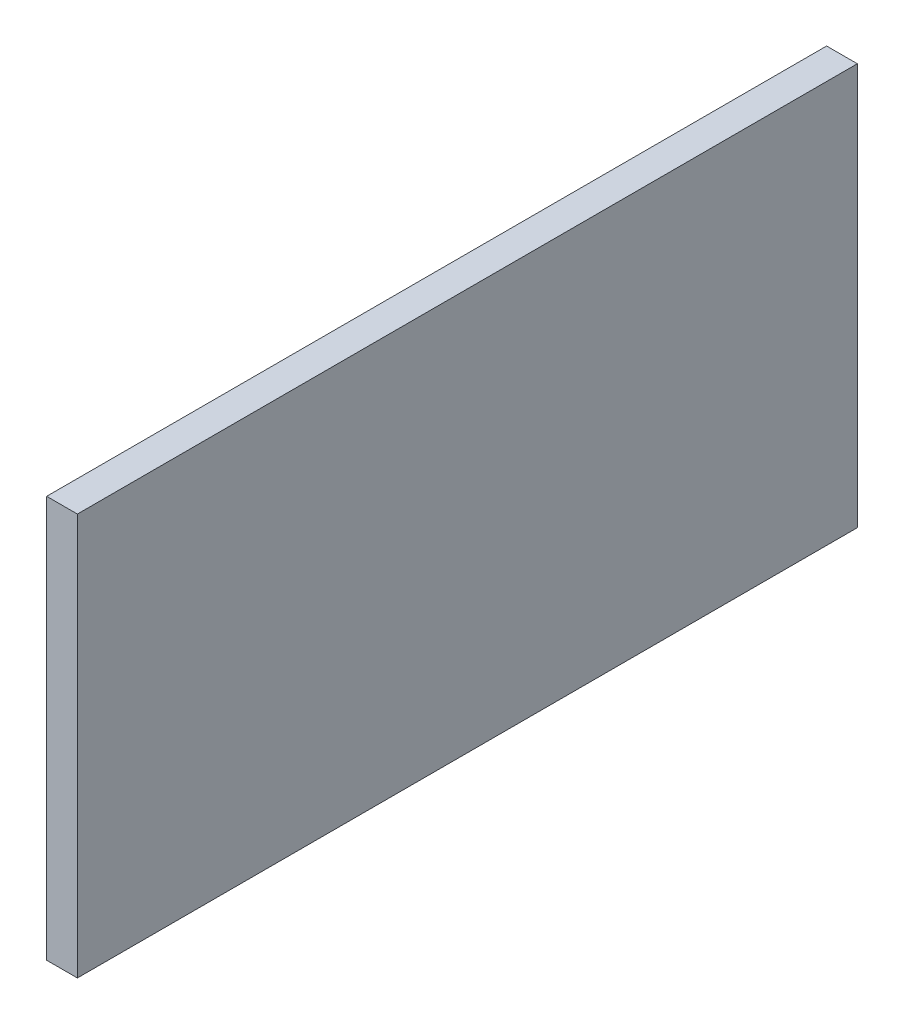
ISO-10303-21;
HEADER;
FILE_DESCRIPTION(('STEP AP214'),'2;1');
FILE_NAME('part.step','',(''),(''),'','','');
FILE_SCHEMA(('AUTOMOTIVE_DESIGN { 1 0 10303 214 1 1 1 1 }'));
ENDSEC;
DATA;
#1=APPLICATION_CONTEXT('core data for automotive mechanical design processes');
#2=APPLICATION_PROTOCOL_DEFINITION('international standard','automotive_design',2000,#1);
#3=PRODUCT_CONTEXT('',#1,'mechanical');
#4=PRODUCT('Part','Part','',(#3));
#5=PRODUCT_RELATED_PRODUCT_CATEGORY('part','',(#4));
#6=PRODUCT_DEFINITION_FORMATION('','',#4);
#7=PRODUCT_DEFINITION_CONTEXT('part definition',#1,'design');
#8=PRODUCT_DEFINITION('design','',#6,#7);
#9=PRODUCT_DEFINITION_SHAPE('','',#8);
#10=(LENGTH_UNIT() NAMED_UNIT(*) SI_UNIT(.MILLI.,.METRE.));
#11=(NAMED_UNIT(*) PLANE_ANGLE_UNIT() SI_UNIT($,.RADIAN.));
#12=(NAMED_UNIT(*) SI_UNIT($,.STERADIAN.) SOLID_ANGLE_UNIT());
#13=UNCERTAINTY_MEASURE_WITH_UNIT(LENGTH_MEASURE(1.E-05),#10,'distance_accuracy_value','');
#14=(GEOMETRIC_REPRESENTATION_CONTEXT(3) GLOBAL_UNCERTAINTY_ASSIGNED_CONTEXT((#13)) GLOBAL_UNIT_ASSIGNED_CONTEXT((#10,
#11,#12)) REPRESENTATION_CONTEXT('',''));
#15=CARTESIAN_POINT('',(0.,0.,0.));
#16=DIRECTION('',(0.,0.,1.));
#17=DIRECTION('',(1.,0.,0.));
#18=AXIS2_PLACEMENT_3D('',#15,#16,#17);
#19=CARTESIAN_POINT('',(1.3,-8.5,-16.5));
#20=DIRECTION('',(0.,0.,1.));
#21=DIRECTION('',(1.,0.,0.));
#22=AXIS2_PLACEMENT_3D('',#19,#20,#21);
#23=PLANE('',#22);
#24=DIRECTION('',(0.,1.,0.));
#25=VECTOR('',#24,1.);
#26=CARTESIAN_POINT('',(0.,-8.5,-16.5));
#27=LINE('',#26,#25);
#28=CARTESIAN_POINT('',(0.,-8.5,-16.5));
#29=VERTEX_POINT('',#28);
#30=CARTESIAN_POINT('',(0.,8.5,-16.5));
#31=VERTEX_POINT('',#30);
#32=EDGE_CURVE('E110',#29,#31,#27,.T.);
#33=ORIENTED_EDGE('',*,*,#32,.T.);
#34=DIRECTION('',(-1.,0.,0.));
#35=VECTOR('',#34,1.);
#36=CARTESIAN_POINT('',(1.3,8.5,-16.5));
#37=LINE('',#36,#35);
#38=CARTESIAN_POINT('',(1.3,8.5,-16.5));
#39=VERTEX_POINT('',#38);
#40=EDGE_CURVE('E11',#39,#31,#37,.T.);
#41=ORIENTED_EDGE('',*,*,#40,.F.);
#42=DIRECTION('',(0.,1.,0.));
#43=VECTOR('',#42,1.);
#44=CARTESIAN_POINT('',(1.3,-8.5,-16.5));
#45=LINE('',#44,#43);
#46=CARTESIAN_POINT('',(1.3,-8.5,-16.5));
#47=VERTEX_POINT('',#46);
#48=EDGE_CURVE('E98',#47,#39,#45,.T.);
#49=ORIENTED_EDGE('',*,*,#48,.F.);
#50=DIRECTION('',(-1.,0.,0.));
#51=VECTOR('',#50,1.);
#52=CARTESIAN_POINT('',(1.3,-8.5,-16.5));
#53=LINE('',#52,#51);
#54=EDGE_CURVE('E106',#47,#29,#53,.T.);
#55=ORIENTED_EDGE('',*,*,#54,.T.);
#56=EDGE_LOOP('',(#33,#41,#49,#55));
#57=FACE_BOUND('',#56,.T.);
#58=ADVANCED_FACE('F47',(#57),#23,.F.);
#59=CARTESIAN_POINT('',(1.3,8.5,16.5));
#60=DIRECTION('',(0.,-1.,0.));
#61=DIRECTION('',(0.,0.,-1.));
#62=AXIS2_PLACEMENT_3D('',#59,#60,#61);
#63=PLANE('',#62);
#64=DIRECTION('',(0.,0.,1.));
#65=VECTOR('',#64,1.);
#66=CARTESIAN_POINT('',(0.,8.5,16.5));
#67=LINE('',#66,#65);
#68=CARTESIAN_POINT('',(0.,8.5,16.5));
#69=VERTEX_POINT('',#68);
#70=EDGE_CURVE('E102',#31,#69,#67,.T.);
#71=ORIENTED_EDGE('',*,*,#70,.T.);
#72=DIRECTION('',(-1.,0.,0.));
#73=VECTOR('',#72,1.);
#74=CARTESIAN_POINT('',(1.3,8.5,16.5));
#75=LINE('',#74,#73);
#76=CARTESIAN_POINT('',(1.3,8.5,16.5));
#77=VERTEX_POINT('',#76);
#78=EDGE_CURVE('E55',#77,#69,#75,.T.);
#79=ORIENTED_EDGE('',*,*,#78,.F.);
#80=DIRECTION('',(0.,0.,1.));
#81=VECTOR('',#80,1.);
#82=CARTESIAN_POINT('',(1.3,8.5,16.5));
#83=LINE('',#82,#81);
#84=EDGE_CURVE('E93',#39,#77,#83,.T.);
#85=ORIENTED_EDGE('',*,*,#84,.F.);
#86=ORIENTED_EDGE('',*,*,#40,.T.);
#87=EDGE_LOOP('',(#71,#79,#85,#86));
#88=FACE_BOUND('',#87,.T.);
#89=ADVANCED_FACE('F101',(#88),#63,.F.);
#90=CARTESIAN_POINT('',(1.3,-8.5,16.5));
#91=DIRECTION('',(0.,0.,-1.));
#92=DIRECTION('',(-1.,0.,0.));
#93=AXIS2_PLACEMENT_3D('',#90,#91,#92);
#94=PLANE('',#93);
#95=DIRECTION('',(0.,-1.,0.));
#96=VECTOR('',#95,1.);
#97=CARTESIAN_POINT('',(0.,-8.5,16.5));
#98=LINE('',#97,#96);
#99=CARTESIAN_POINT('',(0.,-8.5,16.5));
#100=VERTEX_POINT('',#99);
#101=EDGE_CURVE('E80',#69,#100,#98,.T.);
#102=ORIENTED_EDGE('',*,*,#101,.T.);
#103=DIRECTION('',(-1.,0.,0.));
#104=VECTOR('',#103,1.);
#105=CARTESIAN_POINT('',(1.3,-8.5,16.5));
#106=LINE('',#105,#104);
#107=CARTESIAN_POINT('',(1.3,-8.5,16.5));
#108=VERTEX_POINT('',#107);
#109=EDGE_CURVE('E103',#108,#100,#106,.T.);
#110=ORIENTED_EDGE('',*,*,#109,.F.);
#111=DIRECTION('',(0.,-1.,0.));
#112=VECTOR('',#111,1.);
#113=CARTESIAN_POINT('',(1.3,-8.5,16.5));
#114=LINE('',#113,#112);
#115=EDGE_CURVE('E96',#77,#108,#114,.T.);
#116=ORIENTED_EDGE('',*,*,#115,.F.);
#117=ORIENTED_EDGE('',*,*,#78,.T.);
#118=EDGE_LOOP('',(#102,#110,#116,#117));
#119=FACE_BOUND('',#118,.T.);
#120=ADVANCED_FACE('F104',(#119),#94,.F.);
#121=CARTESIAN_POINT('',(1.3,-8.5,16.5));
#122=DIRECTION('',(0.,1.,0.));
#123=DIRECTION('',(0.,0.,1.));
#124=AXIS2_PLACEMENT_3D('',#121,#122,#123);
#125=PLANE('',#124);
#126=DIRECTION('',(0.,0.,-1.));
#127=VECTOR('',#126,1.);
#128=CARTESIAN_POINT('',(0.,-8.5,16.5));
#129=LINE('',#128,#127);
#130=EDGE_CURVE('E86',#100,#29,#129,.T.);
#131=ORIENTED_EDGE('',*,*,#130,.T.);
#132=ORIENTED_EDGE('',*,*,#54,.F.);
#133=DIRECTION('',(0.,0.,-1.));
#134=VECTOR('',#133,1.);
#135=CARTESIAN_POINT('',(1.3,-8.5,16.5));
#136=LINE('',#135,#134);
#137=EDGE_CURVE('E63',#108,#47,#136,.T.);
#138=ORIENTED_EDGE('',*,*,#137,.F.);
#139=ORIENTED_EDGE('',*,*,#109,.T.);
#140=EDGE_LOOP('',(#131,#132,#138,#139));
#141=FACE_BOUND('',#140,.T.);
#142=ADVANCED_FACE('F117',(#141),#125,.F.);
#143=CARTESIAN_POINT('',(1.3,0.,0.));
#144=DIRECTION('',(-1.,0.,0.));
#145=DIRECTION('',(0.,0.,1.));
#146=AXIS2_PLACEMENT_3D('',#143,#144,#145);
#147=PLANE('',#146);
#148=ORIENTED_EDGE('',*,*,#48,.T.);
#149=ORIENTED_EDGE('',*,*,#84,.T.);
#150=ORIENTED_EDGE('',*,*,#115,.T.);
#151=ORIENTED_EDGE('',*,*,#137,.T.);
#152=EDGE_LOOP('',(#148,#149,#150,#151));
#153=FACE_BOUND('',#152,.T.);
#154=ADVANCED_FACE('F94',(#153),#147,.F.);
#155=CARTESIAN_POINT('',(0.,0.,0.));
#156=DIRECTION('',(-1.,0.,0.));
#157=DIRECTION('',(0.,0.,1.));
#158=AXIS2_PLACEMENT_3D('',#155,#156,#157);
#159=PLANE('',#158);
#160=ORIENTED_EDGE('',*,*,#32,.F.);
#161=ORIENTED_EDGE('',*,*,#130,.F.);
#162=ORIENTED_EDGE('',*,*,#101,.F.);
#163=ORIENTED_EDGE('',*,*,#70,.F.);
#164=EDGE_LOOP('',(#160,#161,#162,#163));
#165=FACE_BOUND('',#164,.T.);
#166=ADVANCED_FACE('F120',(#165),#159,.T.);
#167=CLOSED_SHELL('',(#58,#89,#120,#142,#154,#166));
#168=MANIFOLD_SOLID_BREP('B2',#167);
#169=ADVANCED_BREP_SHAPE_REPRESENTATION('',(#18,#168),#14);
#170=SHAPE_DEFINITION_REPRESENTATION(#9,#169);
ENDSEC;
END-ISO-10303-21;
